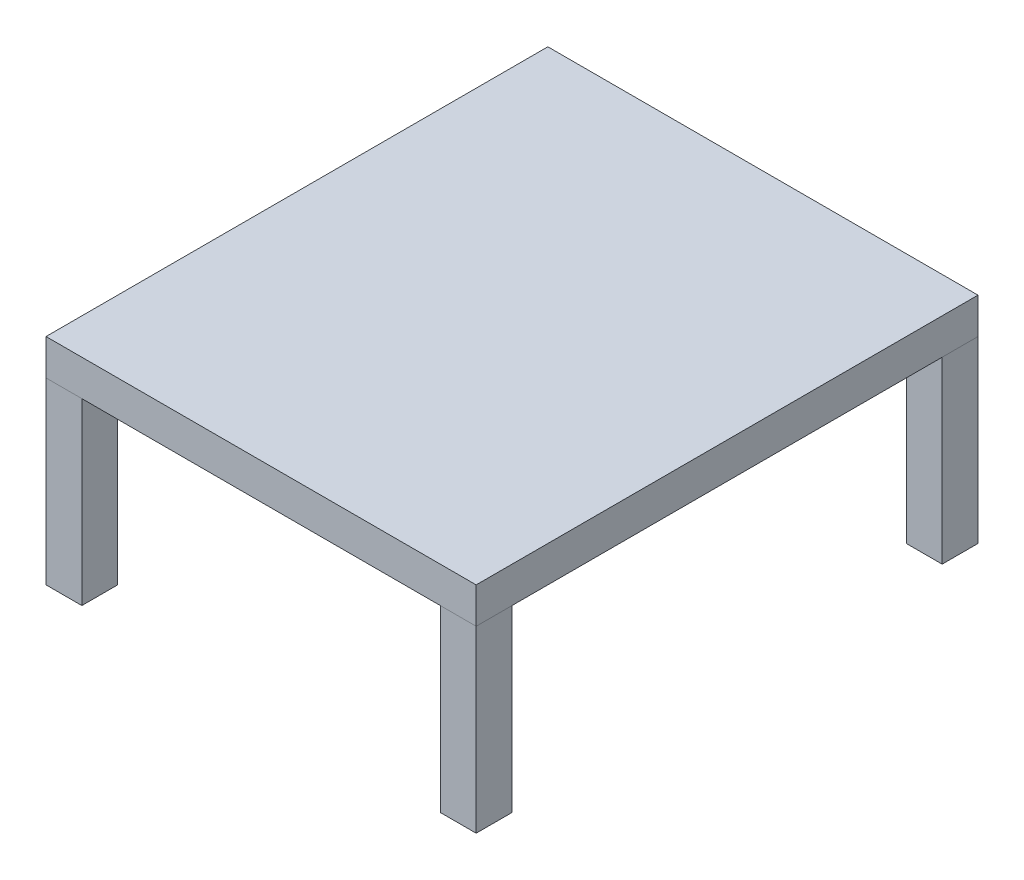
ISO-10303-21;
HEADER;
FILE_DESCRIPTION(('STEP AP214'),'2;1');
FILE_NAME('part.step','',(''),(''),'','','');
FILE_SCHEMA(('AUTOMOTIVE_DESIGN { 1 0 10303 214 1 1 1 1 }'));
ENDSEC;
DATA;
#1=APPLICATION_CONTEXT('core data for automotive mechanical design processes');
#2=APPLICATION_PROTOCOL_DEFINITION('international standard','automotive_design',2000,#1);
#3=PRODUCT_CONTEXT('',#1,'mechanical');
#4=PRODUCT('Part','Part','',(#3));
#5=PRODUCT_RELATED_PRODUCT_CATEGORY('part','',(#4));
#6=PRODUCT_DEFINITION_FORMATION('','',#4);
#7=PRODUCT_DEFINITION_CONTEXT('part definition',#1,'design');
#8=PRODUCT_DEFINITION('design','',#6,#7);
#9=PRODUCT_DEFINITION_SHAPE('','',#8);
#10=(LENGTH_UNIT() NAMED_UNIT(*) SI_UNIT(.MILLI.,.METRE.));
#11=(NAMED_UNIT(*) PLANE_ANGLE_UNIT() SI_UNIT($,.RADIAN.));
#12=(NAMED_UNIT(*) SI_UNIT($,.STERADIAN.) SOLID_ANGLE_UNIT());
#13=UNCERTAINTY_MEASURE_WITH_UNIT(LENGTH_MEASURE(1.E-05),#10,'distance_accuracy_value','');
#14=(GEOMETRIC_REPRESENTATION_CONTEXT(3) GLOBAL_UNCERTAINTY_ASSIGNED_CONTEXT((#13)) GLOBAL_UNIT_ASSIGNED_CONTEXT((#10,
#11,#12)) REPRESENTATION_CONTEXT('',''));
#15=CARTESIAN_POINT('',(0.,0.,0.));
#16=DIRECTION('',(0.,0.,1.));
#17=DIRECTION('',(1.,0.,0.));
#18=AXIS2_PLACEMENT_3D('',#15,#16,#17);
#19=CARTESIAN_POINT('',(304.8,304.8,-355.6));
#20=DIRECTION('',(-1.,0.,0.));
#21=DIRECTION('',(0.,0.,1.));
#22=AXIS2_PLACEMENT_3D('',#19,#20,#21);
#23=PLANE('',#22);
#24=DIRECTION('',(0.,0.,-1.));
#25=VECTOR('',#24,1.);
#26=CARTESIAN_POINT('',(304.8,254.,-355.6));
#27=LINE('',#26,#25);
#28=CARTESIAN_POINT('',(304.8,254.,355.6));
#29=VERTEX_POINT('',#28);
#30=CARTESIAN_POINT('',(304.8,254.,-355.6));
#31=VERTEX_POINT('',#30);
#32=EDGE_CURVE('E108',#29,#31,#27,.T.);
#33=ORIENTED_EDGE('',*,*,#32,.T.);
#34=DIRECTION('',(0.,-1.,0.));
#35=VECTOR('',#34,1.);
#36=CARTESIAN_POINT('',(304.8,304.8,-355.6));
#37=LINE('',#36,#35);
#38=CARTESIAN_POINT('',(304.8,304.8,-355.6));
#39=VERTEX_POINT('',#38);
#40=EDGE_CURVE('E12',#39,#31,#37,.T.);
#41=ORIENTED_EDGE('',*,*,#40,.F.);
#42=DIRECTION('',(0.,0.,-1.));
#43=VECTOR('',#42,1.);
#44=CARTESIAN_POINT('',(304.8,304.8,-355.6));
#45=LINE('',#44,#43);
#46=CARTESIAN_POINT('',(304.8,304.8,355.6));
#47=VERTEX_POINT('',#46);
#48=EDGE_CURVE('E96',#47,#39,#45,.T.);
#49=ORIENTED_EDGE('',*,*,#48,.F.);
#50=DIRECTION('',(0.,-1.,0.));
#51=VECTOR('',#50,1.);
#52=CARTESIAN_POINT('',(304.8,304.8,355.6));
#53=LINE('',#52,#51);
#54=EDGE_CURVE('E104',#47,#29,#53,.T.);
#55=ORIENTED_EDGE('',*,*,#54,.T.);
#56=EDGE_LOOP('',(#33,#41,#49,#55));
#57=FACE_BOUND('',#56,.T.);
#58=ADVANCED_FACE('F45',(#57),#23,.F.);
#59=CARTESIAN_POINT('',(304.8,304.8,-355.6));
#60=DIRECTION('',(0.,0.,1.));
#61=DIRECTION('',(1.,0.,0.));
#62=AXIS2_PLACEMENT_3D('',#59,#60,#61);
#63=PLANE('',#62);
#64=DIRECTION('',(-1.,0.,0.));
#65=VECTOR('',#64,1.);
#66=CARTESIAN_POINT('',(304.8,254.,-355.6));
#67=LINE('',#66,#65);
#68=CARTESIAN_POINT('',(-304.8,254.,-355.6));
#69=VERTEX_POINT('',#68);
#70=EDGE_CURVE('E100',#31,#69,#67,.T.);
#71=ORIENTED_EDGE('',*,*,#70,.T.);
#72=DIRECTION('',(0.,-1.,0.));
#73=VECTOR('',#72,1.);
#74=CARTESIAN_POINT('',(-304.8,304.8,-355.6));
#75=LINE('',#74,#73);
#76=CARTESIAN_POINT('',(-304.8,304.8,-355.6));
#77=VERTEX_POINT('',#76);
#78=EDGE_CURVE('E53',#77,#69,#75,.T.);
#79=ORIENTED_EDGE('',*,*,#78,.F.);
#80=DIRECTION('',(-1.,0.,0.));
#81=VECTOR('',#80,1.);
#82=CARTESIAN_POINT('',(304.8,304.8,-355.6));
#83=LINE('',#82,#81);
#84=EDGE_CURVE('E91',#39,#77,#83,.T.);
#85=ORIENTED_EDGE('',*,*,#84,.F.);
#86=ORIENTED_EDGE('',*,*,#40,.T.);
#87=EDGE_LOOP('',(#71,#79,#85,#86));
#88=FACE_BOUND('',#87,.T.);
#89=ADVANCED_FACE('F99',(#88),#63,.F.);
#90=CARTESIAN_POINT('',(-304.8,304.8,-355.6));
#91=DIRECTION('',(1.,0.,0.));
#92=DIRECTION('',(0.,0.,-1.));
#93=AXIS2_PLACEMENT_3D('',#90,#91,#92);
#94=PLANE('',#93);
#95=DIRECTION('',(0.,0.,1.));
#96=VECTOR('',#95,1.);
#97=CARTESIAN_POINT('',(-304.8,254.,-355.6));
#98=LINE('',#97,#96);
#99=CARTESIAN_POINT('',(-304.8,254.,355.6));
#100=VERTEX_POINT('',#99);
#101=EDGE_CURVE('E78',#69,#100,#98,.T.);
#102=ORIENTED_EDGE('',*,*,#101,.T.);
#103=DIRECTION('',(0.,-1.,0.));
#104=VECTOR('',#103,1.);
#105=CARTESIAN_POINT('',(-304.8,304.8,355.6));
#106=LINE('',#105,#104);
#107=CARTESIAN_POINT('',(-304.8,304.8,355.6));
#108=VERTEX_POINT('',#107);
#109=EDGE_CURVE('E101',#108,#100,#106,.T.);
#110=ORIENTED_EDGE('',*,*,#109,.F.);
#111=DIRECTION('',(0.,0.,1.));
#112=VECTOR('',#111,1.);
#113=CARTESIAN_POINT('',(-304.8,304.8,-355.6));
#114=LINE('',#113,#112);
#115=EDGE_CURVE('E94',#77,#108,#114,.T.);
#116=ORIENTED_EDGE('',*,*,#115,.F.);
#117=ORIENTED_EDGE('',*,*,#78,.T.);
#118=EDGE_LOOP('',(#102,#110,#116,#117));
#119=FACE_BOUND('',#118,.T.);
#120=ADVANCED_FACE('F102',(#119),#94,.F.);
#121=CARTESIAN_POINT('',(304.8,304.8,355.6));
#122=DIRECTION('',(0.,0.,-1.));
#123=DIRECTION('',(-1.,0.,0.));
#124=AXIS2_PLACEMENT_3D('',#121,#122,#123);
#125=PLANE('',#124);
#126=DIRECTION('',(1.,0.,0.));
#127=VECTOR('',#126,1.);
#128=CARTESIAN_POINT('',(304.8,254.,355.6));
#129=LINE('',#128,#127);
#130=EDGE_CURVE('E84',#100,#29,#129,.T.);
#131=ORIENTED_EDGE('',*,*,#130,.T.);
#132=ORIENTED_EDGE('',*,*,#54,.F.);
#133=DIRECTION('',(1.,0.,0.));
#134=VECTOR('',#133,1.);
#135=CARTESIAN_POINT('',(304.8,304.8,355.6));
#136=LINE('',#135,#134);
#137=EDGE_CURVE('E61',#108,#47,#136,.T.);
#138=ORIENTED_EDGE('',*,*,#137,.F.);
#139=ORIENTED_EDGE('',*,*,#109,.T.);
#140=EDGE_LOOP('',(#131,#132,#138,#139));
#141=FACE_BOUND('',#140,.T.);
#142=ADVANCED_FACE('F115',(#141),#125,.F.);
#143=CARTESIAN_POINT('',(0.,304.8,0.));
#144=DIRECTION('',(0.,-1.,0.));
#145=DIRECTION('',(0.,0.,-1.));
#146=AXIS2_PLACEMENT_3D('',#143,#144,#145);
#147=PLANE('',#146);
#148=ORIENTED_EDGE('',*,*,#48,.T.);
#149=ORIENTED_EDGE('',*,*,#84,.T.);
#150=ORIENTED_EDGE('',*,*,#115,.T.);
#151=ORIENTED_EDGE('',*,*,#137,.T.);
#152=EDGE_LOOP('',(#148,#149,#150,#151));
#153=FACE_BOUND('',#152,.T.);
#154=ADVANCED_FACE('F92',(#153),#147,.F.);
#155=CARTESIAN_POINT('',(0.,254.,0.));
#156=DIRECTION('',(0.,-1.,0.));
#157=DIRECTION('',(0.,0.,-1.));
#158=AXIS2_PLACEMENT_3D('',#155,#156,#157);
#159=PLANE('',#158);
#160=ORIENTED_EDGE('',*,*,#32,.F.);
#161=ORIENTED_EDGE('',*,*,#130,.F.);
#162=ORIENTED_EDGE('',*,*,#101,.F.);
#163=ORIENTED_EDGE('',*,*,#70,.F.);
#164=EDGE_LOOP('',(#160,#161,#162,#163));
#165=FACE_BOUND('',#164,.T.);
#166=ADVANCED_FACE('F118',(#165),#159,.T.);
#167=CLOSED_SHELL('',(#58,#89,#120,#142,#154,#166));
#168=MANIFOLD_SOLID_BREP('B2',#167);
#169=CARTESIAN_POINT('',(304.8,254.,355.6));
#170=DIRECTION('',(0.,0.,-1.));
#171=DIRECTION('',(1.,0.,0.));
#172=AXIS2_PLACEMENT_3D('',#169,#170,#171);
#173=PLANE('',#172);
#174=DIRECTION('',(-1.,0.,0.));
#175=VECTOR('',#174,1.);
#176=CARTESIAN_POINT('',(304.8,0.,355.6));
#177=LINE('',#176,#175);
#178=CARTESIAN_POINT('',(304.8,0.,355.6));
#179=VERTEX_POINT('',#178);
#180=CARTESIAN_POINT('',(254.,0.,355.6));
#181=VERTEX_POINT('',#180);
#182=EDGE_CURVE('E241',#179,#181,#177,.T.);
#183=ORIENTED_EDGE('',*,*,#182,.F.);
#184=DIRECTION('',(0.,-1.,0.));
#185=VECTOR('',#184,1.);
#186=CARTESIAN_POINT('',(304.8,254.,355.6));
#187=LINE('',#186,#185);
#188=CARTESIAN_POINT('',(304.8,254.,355.6));
#189=VERTEX_POINT('',#188);
#190=EDGE_CURVE('E240',#189,#179,#187,.T.);
#191=ORIENTED_EDGE('',*,*,#190,.F.);
#192=DIRECTION('',(-1.,0.,0.));
#193=VECTOR('',#192,1.);
#194=CARTESIAN_POINT('',(304.8,254.,355.6));
#195=LINE('',#194,#193);
#196=CARTESIAN_POINT('',(254.,254.,355.6));
#197=VERTEX_POINT('',#196);
#198=EDGE_CURVE('E235',#189,#197,#195,.T.);
#199=ORIENTED_EDGE('',*,*,#198,.T.);
#200=DIRECTION('',(0.,-1.,0.));
#201=VECTOR('',#200,1.);
#202=CARTESIAN_POINT('',(254.,254.,355.6));
#203=LINE('',#202,#201);
#204=EDGE_CURVE('E43',#197,#181,#203,.T.);
#205=ORIENTED_EDGE('',*,*,#204,.T.);
#206=EDGE_LOOP('',(#183,#191,#199,#205));
#207=FACE_BOUND('',#206,.T.);
#208=ADVANCED_FACE('F178',(#207),#173,.F.);
#209=CARTESIAN_POINT('',(254.,254.,355.6));
#210=DIRECTION('',(1.,0.,0.));
#211=DIRECTION('',(0.,0.,1.));
#212=AXIS2_PLACEMENT_3D('',#209,#210,#211);
#213=PLANE('',#212);
#214=DIRECTION('',(0.,0.,-1.));
#215=VECTOR('',#214,1.);
#216=CARTESIAN_POINT('',(254.,0.,355.6));
#217=LINE('',#216,#215);
#218=CARTESIAN_POINT('',(254.,0.,304.8));
#219=VERTEX_POINT('',#218);
#220=EDGE_CURVE('E243',#181,#219,#217,.T.);
#221=ORIENTED_EDGE('',*,*,#220,.F.);
#222=ORIENTED_EDGE('',*,*,#204,.F.);
#223=DIRECTION('',(0.,0.,-1.));
#224=VECTOR('',#223,1.);
#225=CARTESIAN_POINT('',(254.,254.,355.6));
#226=LINE('',#225,#224);
#227=CARTESIAN_POINT('',(254.,254.,304.8));
#228=VERTEX_POINT('',#227);
#229=EDGE_CURVE('E219',#197,#228,#226,.T.);
#230=ORIENTED_EDGE('',*,*,#229,.T.);
#231=DIRECTION('',(0.,-1.,0.));
#232=VECTOR('',#231,1.);
#233=CARTESIAN_POINT('',(254.,254.,304.8));
#234=LINE('',#233,#232);
#235=EDGE_CURVE('E186',#228,#219,#234,.T.);
#236=ORIENTED_EDGE('',*,*,#235,.T.);
#237=EDGE_LOOP('',(#221,#222,#230,#236));
#238=FACE_BOUND('',#237,.T.);
#239=ADVANCED_FACE('F233',(#238),#213,.F.);
#240=CARTESIAN_POINT('',(304.8,254.,304.8));
#241=DIRECTION('',(0.,0.,1.));
#242=DIRECTION('',(-1.,0.,0.));
#243=AXIS2_PLACEMENT_3D('',#240,#241,#242);
#244=PLANE('',#243);
#245=DIRECTION('',(1.,0.,0.));
#246=VECTOR('',#245,1.);
#247=CARTESIAN_POINT('',(304.8,0.,304.8));
#248=LINE('',#247,#246);
#249=CARTESIAN_POINT('',(304.8,0.,304.8));
#250=VERTEX_POINT('',#249);
#251=EDGE_CURVE('E229',#219,#250,#248,.T.);
#252=ORIENTED_EDGE('',*,*,#251,.F.);
#253=ORIENTED_EDGE('',*,*,#235,.F.);
#254=DIRECTION('',(1.,0.,0.));
#255=VECTOR('',#254,1.);
#256=CARTESIAN_POINT('',(304.8,254.,304.8));
#257=LINE('',#256,#255);
#258=CARTESIAN_POINT('',(304.8,254.,304.8));
#259=VERTEX_POINT('',#258);
#260=EDGE_CURVE('E222',#228,#259,#257,.T.);
#261=ORIENTED_EDGE('',*,*,#260,.T.);
#262=DIRECTION('',(0.,-1.,0.));
#263=VECTOR('',#262,1.);
#264=CARTESIAN_POINT('',(304.8,254.,304.8));
#265=LINE('',#264,#263);
#266=EDGE_CURVE('E232',#259,#250,#265,.T.);
#267=ORIENTED_EDGE('',*,*,#266,.T.);
#268=EDGE_LOOP('',(#252,#253,#261,#267));
#269=FACE_BOUND('',#268,.T.);
#270=ADVANCED_FACE('F228',(#269),#244,.F.);
#271=CARTESIAN_POINT('',(304.8,254.,355.6));
#272=DIRECTION('',(-1.,0.,0.));
#273=DIRECTION('',(0.,0.,-1.));
#274=AXIS2_PLACEMENT_3D('',#271,#272,#273);
#275=PLANE('',#274);
#276=DIRECTION('',(0.,0.,1.));
#277=VECTOR('',#276,1.);
#278=CARTESIAN_POINT('',(304.8,0.,355.6));
#279=LINE('',#278,#277);
#280=EDGE_CURVE('E208',#250,#179,#279,.T.);
#281=ORIENTED_EDGE('',*,*,#280,.F.);
#282=ORIENTED_EDGE('',*,*,#266,.F.);
#283=DIRECTION('',(0.,0.,1.));
#284=VECTOR('',#283,1.);
#285=CARTESIAN_POINT('',(304.8,254.,355.6));
#286=LINE('',#285,#284);
#287=EDGE_CURVE('E194',#259,#189,#286,.T.);
#288=ORIENTED_EDGE('',*,*,#287,.T.);
#289=ORIENTED_EDGE('',*,*,#190,.T.);
#290=EDGE_LOOP('',(#281,#282,#288,#289));
#291=FACE_BOUND('',#290,.T.);
#292=ADVANCED_FACE('F252',(#291),#275,.F.);
#293=CARTESIAN_POINT('',(0.,254.,0.));
#294=DIRECTION('',(0.,1.,0.));
#295=DIRECTION('',(0.,0.,1.));
#296=AXIS2_PLACEMENT_3D('',#293,#294,#295);
#297=PLANE('',#296);
#298=ORIENTED_EDGE('',*,*,#198,.F.);
#299=ORIENTED_EDGE('',*,*,#287,.F.);
#300=ORIENTED_EDGE('',*,*,#260,.F.);
#301=ORIENTED_EDGE('',*,*,#229,.F.);
#302=EDGE_LOOP('',(#298,#299,#300,#301));
#303=FACE_BOUND('',#302,.T.);
#304=ADVANCED_FACE('F224',(#303),#297,.T.);
#305=CARTESIAN_POINT('',(0.,0.,0.));
#306=DIRECTION('',(0.,1.,0.));
#307=DIRECTION('',(0.,0.,1.));
#308=AXIS2_PLACEMENT_3D('',#305,#306,#307);
#309=PLANE('',#308);
#310=ORIENTED_EDGE('',*,*,#182,.T.);
#311=ORIENTED_EDGE('',*,*,#220,.T.);
#312=ORIENTED_EDGE('',*,*,#251,.T.);
#313=ORIENTED_EDGE('',*,*,#280,.T.);
#314=EDGE_LOOP('',(#310,#311,#312,#313));
#315=FACE_BOUND('',#314,.T.);
#316=ADVANCED_FACE('F248',(#315),#309,.F.);
#317=CLOSED_SHELL('',(#208,#239,#270,#292,#304,#316));
#318=MANIFOLD_SOLID_BREP('B6',#317);
#319=CARTESIAN_POINT('',(254.,254.,-355.6));
#320=DIRECTION('',(1.,0.,0.));
#321=DIRECTION('',(0.,0.,1.));
#322=AXIS2_PLACEMENT_3D('',#319,#320,#321);
#323=PLANE('',#322);
#324=DIRECTION('',(0.,0.,-1.));
#325=VECTOR('',#324,1.);
#326=CARTESIAN_POINT('',(254.,0.,-355.6));
#327=LINE('',#326,#325);
#328=CARTESIAN_POINT('',(254.,0.,-304.8));
#329=VERTEX_POINT('',#328);
#330=CARTESIAN_POINT('',(254.,0.,-355.6));
#331=VERTEX_POINT('',#330);
#332=EDGE_CURVE('E374',#329,#331,#327,.T.);
#333=ORIENTED_EDGE('',*,*,#332,.F.);
#334=DIRECTION('',(0.,-1.,0.));
#335=VECTOR('',#334,1.);
#336=CARTESIAN_POINT('',(254.,254.,-304.8));
#337=LINE('',#336,#335);
#338=CARTESIAN_POINT('',(254.,254.,-304.8));
#339=VERTEX_POINT('',#338);
#340=EDGE_CURVE('E373',#339,#329,#337,.T.);
#341=ORIENTED_EDGE('',*,*,#340,.F.);
#342=DIRECTION('',(0.,0.,-1.));
#343=VECTOR('',#342,1.);
#344=CARTESIAN_POINT('',(254.,254.,-355.6));
#345=LINE('',#344,#343);
#346=CARTESIAN_POINT('',(254.,254.,-355.6));
#347=VERTEX_POINT('',#346);
#348=EDGE_CURVE('E368',#339,#347,#345,.T.);
#349=ORIENTED_EDGE('',*,*,#348,.T.);
#350=DIRECTION('',(0.,-1.,0.));
#351=VECTOR('',#350,1.);
#352=CARTESIAN_POINT('',(254.,254.,-355.6));
#353=LINE('',#352,#351);
#354=EDGE_CURVE('E176',#347,#331,#353,.T.);
#355=ORIENTED_EDGE('',*,*,#354,.T.);
#356=EDGE_LOOP('',(#333,#341,#349,#355));
#357=FACE_BOUND('',#356,.T.);
#358=ADVANCED_FACE('F311',(#357),#323,.F.);
#359=CARTESIAN_POINT('',(304.8,254.,-355.6));
#360=DIRECTION('',(0.,0.,1.));
#361=DIRECTION('',(-1.,0.,0.));
#362=AXIS2_PLACEMENT_3D('',#359,#360,#361);
#363=PLANE('',#362);
#364=DIRECTION('',(1.,0.,0.));
#365=VECTOR('',#364,1.);
#366=CARTESIAN_POINT('',(304.8,0.,-355.6));
#367=LINE('',#366,#365);
#368=CARTESIAN_POINT('',(304.8,0.,-355.6));
#369=VERTEX_POINT('',#368);
#370=EDGE_CURVE('E376',#331,#369,#367,.T.);
#371=ORIENTED_EDGE('',*,*,#370,.F.);
#372=ORIENTED_EDGE('',*,*,#354,.F.);
#373=DIRECTION('',(1.,0.,0.));
#374=VECTOR('',#373,1.);
#375=CARTESIAN_POINT('',(304.8,254.,-355.6));
#376=LINE('',#375,#374);
#377=CARTESIAN_POINT('',(304.8,254.,-355.6));
#378=VERTEX_POINT('',#377);
#379=EDGE_CURVE('E352',#347,#378,#376,.T.);
#380=ORIENTED_EDGE('',*,*,#379,.T.);
#381=DIRECTION('',(0.,-1.,0.));
#382=VECTOR('',#381,1.);
#383=CARTESIAN_POINT('',(304.8,254.,-355.6));
#384=LINE('',#383,#382);
#385=EDGE_CURVE('E319',#378,#369,#384,.T.);
#386=ORIENTED_EDGE('',*,*,#385,.T.);
#387=EDGE_LOOP('',(#371,#372,#380,#386));
#388=FACE_BOUND('',#387,.T.);
#389=ADVANCED_FACE('F366',(#388),#363,.F.);
#390=CARTESIAN_POINT('',(304.8,254.,-355.6));
#391=DIRECTION('',(-1.,0.,0.));
#392=DIRECTION('',(0.,0.,-1.));
#393=AXIS2_PLACEMENT_3D('',#390,#391,#392);
#394=PLANE('',#393);
#395=DIRECTION('',(0.,0.,1.));
#396=VECTOR('',#395,1.);
#397=CARTESIAN_POINT('',(304.8,0.,-355.6));
#398=LINE('',#397,#396);
#399=CARTESIAN_POINT('',(304.8,0.,-304.8));
#400=VERTEX_POINT('',#399);
#401=EDGE_CURVE('E362',#369,#400,#398,.T.);
#402=ORIENTED_EDGE('',*,*,#401,.F.);
#403=ORIENTED_EDGE('',*,*,#385,.F.);
#404=DIRECTION('',(0.,0.,1.));
#405=VECTOR('',#404,1.);
#406=CARTESIAN_POINT('',(304.8,254.,-355.6));
#407=LINE('',#406,#405);
#408=CARTESIAN_POINT('',(304.8,254.,-304.8));
#409=VERTEX_POINT('',#408);
#410=EDGE_CURVE('E355',#378,#409,#407,.T.);
#411=ORIENTED_EDGE('',*,*,#410,.T.);
#412=DIRECTION('',(0.,-1.,0.));
#413=VECTOR('',#412,1.);
#414=CARTESIAN_POINT('',(304.8,254.,-304.8));
#415=LINE('',#414,#413);
#416=EDGE_CURVE('E365',#409,#400,#415,.T.);
#417=ORIENTED_EDGE('',*,*,#416,.T.);
#418=EDGE_LOOP('',(#402,#403,#411,#417));
#419=FACE_BOUND('',#418,.T.);
#420=ADVANCED_FACE('F361',(#419),#394,.F.);
#421=CARTESIAN_POINT('',(304.8,254.,-304.8));
#422=DIRECTION('',(0.,0.,-1.));
#423=DIRECTION('',(1.,0.,0.));
#424=AXIS2_PLACEMENT_3D('',#421,#422,#423);
#425=PLANE('',#424);
#426=DIRECTION('',(-1.,0.,0.));
#427=VECTOR('',#426,1.);
#428=CARTESIAN_POINT('',(304.8,0.,-304.8));
#429=LINE('',#428,#427);
#430=EDGE_CURVE('E341',#400,#329,#429,.T.);
#431=ORIENTED_EDGE('',*,*,#430,.F.);
#432=ORIENTED_EDGE('',*,*,#416,.F.);
#433=DIRECTION('',(-1.,0.,0.));
#434=VECTOR('',#433,1.);
#435=CARTESIAN_POINT('',(304.8,254.,-304.8));
#436=LINE('',#435,#434);
#437=EDGE_CURVE('E327',#409,#339,#436,.T.);
#438=ORIENTED_EDGE('',*,*,#437,.T.);
#439=ORIENTED_EDGE('',*,*,#340,.T.);
#440=EDGE_LOOP('',(#431,#432,#438,#439));
#441=FACE_BOUND('',#440,.T.);
#442=ADVANCED_FACE('F385',(#441),#425,.F.);
#443=CARTESIAN_POINT('',(0.,254.,0.));
#444=DIRECTION('',(0.,1.,0.));
#445=DIRECTION('',(0.,0.,1.));
#446=AXIS2_PLACEMENT_3D('',#443,#444,#445);
#447=PLANE('',#446);
#448=ORIENTED_EDGE('',*,*,#348,.F.);
#449=ORIENTED_EDGE('',*,*,#437,.F.);
#450=ORIENTED_EDGE('',*,*,#410,.F.);
#451=ORIENTED_EDGE('',*,*,#379,.F.);
#452=EDGE_LOOP('',(#448,#449,#450,#451));
#453=FACE_BOUND('',#452,.T.);
#454=ADVANCED_FACE('F357',(#453),#447,.T.);
#455=CARTESIAN_POINT('',(0.,0.,0.));
#456=DIRECTION('',(0.,1.,0.));
#457=DIRECTION('',(0.,0.,1.));
#458=AXIS2_PLACEMENT_3D('',#455,#456,#457);
#459=PLANE('',#458);
#460=ORIENTED_EDGE('',*,*,#332,.T.);
#461=ORIENTED_EDGE('',*,*,#370,.T.);
#462=ORIENTED_EDGE('',*,*,#401,.T.);
#463=ORIENTED_EDGE('',*,*,#430,.T.);
#464=EDGE_LOOP('',(#460,#461,#462,#463));
#465=FACE_BOUND('',#464,.T.);
#466=ADVANCED_FACE('F381',(#465),#459,.F.);
#467=CLOSED_SHELL('',(#358,#389,#420,#442,#454,#466));
#468=MANIFOLD_SOLID_BREP('B37',#467);
#469=CARTESIAN_POINT('',(-304.8,254.,355.6));
#470=DIRECTION('',(0.,0.,-1.));
#471=DIRECTION('',(-1.,0.,0.));
#472=AXIS2_PLACEMENT_3D('',#469,#470,#471);
#473=PLANE('',#472);
#474=DIRECTION('',(1.,0.,0.));
#475=VECTOR('',#474,1.);
#476=CARTESIAN_POINT('',(-304.8,0.,355.6));
#477=LINE('',#476,#475);
#478=CARTESIAN_POINT('',(-304.8,0.,355.6));
#479=VERTEX_POINT('',#478);
#480=CARTESIAN_POINT('',(-254.,0.,355.6));
#481=VERTEX_POINT('',#480);
#482=EDGE_CURVE('E506',#479,#481,#477,.T.);
#483=ORIENTED_EDGE('',*,*,#482,.T.);
#484=DIRECTION('',(0.,-1.,0.));
#485=VECTOR('',#484,1.);
#486=CARTESIAN_POINT('',(-254.,254.,355.6));
#487=LINE('',#486,#485);
#488=CARTESIAN_POINT('',(-254.,254.,355.6));
#489=VERTEX_POINT('',#488);
#490=EDGE_CURVE('E309',#489,#481,#487,.T.);
#491=ORIENTED_EDGE('',*,*,#490,.F.);
#492=DIRECTION('',(1.,0.,0.));
#493=VECTOR('',#492,1.);
#494=CARTESIAN_POINT('',(-304.8,254.,355.6));
#495=LINE('',#494,#493);
#496=CARTESIAN_POINT('',(-304.8,254.,355.6));
#497=VERTEX_POINT('',#496);
#498=EDGE_CURVE('E494',#497,#489,#495,.T.);
#499=ORIENTED_EDGE('',*,*,#498,.F.);
#500=DIRECTION('',(0.,-1.,0.));
#501=VECTOR('',#500,1.);
#502=CARTESIAN_POINT('',(-304.8,254.,355.6));
#503=LINE('',#502,#501);
#504=EDGE_CURVE('E502',#497,#479,#503,.T.);
#505=ORIENTED_EDGE('',*,*,#504,.T.);
#506=EDGE_LOOP('',(#483,#491,#499,#505));
#507=FACE_BOUND('',#506,.T.);
#508=ADVANCED_FACE('F443',(#507),#473,.F.);
#509=CARTESIAN_POINT('',(-254.,254.,355.6));
#510=DIRECTION('',(-1.,0.,0.));
#511=DIRECTION('',(0.,0.,1.));
#512=AXIS2_PLACEMENT_3D('',#509,#510,#511);
#513=PLANE('',#512);
#514=DIRECTION('',(0.,0.,-1.));
#515=VECTOR('',#514,1.);
#516=CARTESIAN_POINT('',(-254.,0.,355.6));
#517=LINE('',#516,#515);
#518=CARTESIAN_POINT('',(-254.,0.,304.8));
#519=VERTEX_POINT('',#518);
#520=EDGE_CURVE('E498',#481,#519,#517,.T.);
#521=ORIENTED_EDGE('',*,*,#520,.T.);
#522=DIRECTION('',(0.,-1.,0.));
#523=VECTOR('',#522,1.);
#524=CARTESIAN_POINT('',(-254.,254.,304.8));
#525=LINE('',#524,#523);
#526=CARTESIAN_POINT('',(-254.,254.,304.8));
#527=VERTEX_POINT('',#526);
#528=EDGE_CURVE('E451',#527,#519,#525,.T.);
#529=ORIENTED_EDGE('',*,*,#528,.F.);
#530=DIRECTION('',(0.,0.,-1.));
#531=VECTOR('',#530,1.);
#532=CARTESIAN_POINT('',(-254.,254.,355.6));
#533=LINE('',#532,#531);
#534=EDGE_CURVE('E489',#489,#527,#533,.T.);
#535=ORIENTED_EDGE('',*,*,#534,.F.);
#536=ORIENTED_EDGE('',*,*,#490,.T.);
#537=EDGE_LOOP('',(#521,#529,#535,#536));
#538=FACE_BOUND('',#537,.T.);
#539=ADVANCED_FACE('F497',(#538),#513,.F.);
#540=CARTESIAN_POINT('',(-304.8,254.,304.8));
#541=DIRECTION('',(0.,0.,1.));
#542=DIRECTION('',(1.,0.,0.));
#543=AXIS2_PLACEMENT_3D('',#540,#541,#542);
#544=PLANE('',#543);
#545=DIRECTION('',(-1.,0.,0.));
#546=VECTOR('',#545,1.);
#547=CARTESIAN_POINT('',(-304.8,0.,304.8));
#548=LINE('',#547,#546);
#549=CARTESIAN_POINT('',(-304.8,0.,304.8));
#550=VERTEX_POINT('',#549);
#551=EDGE_CURVE('E476',#519,#550,#548,.T.);
#552=ORIENTED_EDGE('',*,*,#551,.T.);
#553=DIRECTION('',(0.,-1.,0.));
#554=VECTOR('',#553,1.);
#555=CARTESIAN_POINT('',(-304.8,254.,304.8));
#556=LINE('',#555,#554);
#557=CARTESIAN_POINT('',(-304.8,254.,304.8));
#558=VERTEX_POINT('',#557);
#559=EDGE_CURVE('E499',#558,#550,#556,.T.);
#560=ORIENTED_EDGE('',*,*,#559,.F.);
#561=DIRECTION('',(-1.,0.,0.));
#562=VECTOR('',#561,1.);
#563=CARTESIAN_POINT('',(-304.8,254.,304.8));
#564=LINE('',#563,#562);
#565=EDGE_CURVE('E492',#527,#558,#564,.T.);
#566=ORIENTED_EDGE('',*,*,#565,.F.);
#567=ORIENTED_EDGE('',*,*,#528,.T.);
#568=EDGE_LOOP('',(#552,#560,#566,#567));
#569=FACE_BOUND('',#568,.T.);
#570=ADVANCED_FACE('F500',(#569),#544,.F.);
#571=CARTESIAN_POINT('',(-304.8,254.,355.6));
#572=DIRECTION('',(1.,0.,0.));
#573=DIRECTION('',(0.,0.,-1.));
#574=AXIS2_PLACEMENT_3D('',#571,#572,#573);
#575=PLANE('',#574);
#576=DIRECTION('',(0.,0.,1.));
#577=VECTOR('',#576,1.);
#578=CARTESIAN_POINT('',(-304.8,0.,355.6));
#579=LINE('',#578,#577);
#580=EDGE_CURVE('E482',#550,#479,#579,.T.);
#581=ORIENTED_EDGE('',*,*,#580,.T.);
#582=ORIENTED_EDGE('',*,*,#504,.F.);
#583=DIRECTION('',(0.,0.,1.));
#584=VECTOR('',#583,1.);
#585=CARTESIAN_POINT('',(-304.8,254.,355.6));
#586=LINE('',#585,#584);
#587=EDGE_CURVE('E459',#558,#497,#586,.T.);
#588=ORIENTED_EDGE('',*,*,#587,.F.);
#589=ORIENTED_EDGE('',*,*,#559,.T.);
#590=EDGE_LOOP('',(#581,#582,#588,#589));
#591=FACE_BOUND('',#590,.T.);
#592=ADVANCED_FACE('F513',(#591),#575,.F.);
#593=CARTESIAN_POINT('',(0.,254.,0.));
#594=DIRECTION('',(0.,1.,0.));
#595=DIRECTION('',(0.,0.,1.));
#596=AXIS2_PLACEMENT_3D('',#593,#594,#595);
#597=PLANE('',#596);
#598=ORIENTED_EDGE('',*,*,#498,.T.);
#599=ORIENTED_EDGE('',*,*,#534,.T.);
#600=ORIENTED_EDGE('',*,*,#565,.T.);
#601=ORIENTED_EDGE('',*,*,#587,.T.);
#602=EDGE_LOOP('',(#598,#599,#600,#601));
#603=FACE_BOUND('',#602,.T.);
#604=ADVANCED_FACE('F490',(#603),#597,.T.);
#605=CARTESIAN_POINT('',(0.,0.,0.));
#606=DIRECTION('',(0.,1.,0.));
#607=DIRECTION('',(0.,0.,1.));
#608=AXIS2_PLACEMENT_3D('',#605,#606,#607);
#609=PLANE('',#608);
#610=ORIENTED_EDGE('',*,*,#482,.F.);
#611=ORIENTED_EDGE('',*,*,#580,.F.);
#612=ORIENTED_EDGE('',*,*,#551,.F.);
#613=ORIENTED_EDGE('',*,*,#520,.F.);
#614=EDGE_LOOP('',(#610,#611,#612,#613));
#615=FACE_BOUND('',#614,.T.);
#616=ADVANCED_FACE('F516',(#615),#609,.F.);
#617=CLOSED_SHELL('',(#508,#539,#570,#592,#604,#616));
#618=MANIFOLD_SOLID_BREP('B170',#617);
#619=CARTESIAN_POINT('',(-254.,254.,-355.6));
#620=DIRECTION('',(-1.,0.,0.));
#621=DIRECTION('',(0.,0.,1.));
#622=AXIS2_PLACEMENT_3D('',#619,#620,#621);
#623=PLANE('',#622);
#624=DIRECTION('',(0.,0.,-1.));
#625=VECTOR('',#624,1.);
#626=CARTESIAN_POINT('',(-254.,0.,-355.6));
#627=LINE('',#626,#625);
#628=CARTESIAN_POINT('',(-254.,0.,-304.8));
#629=VERTEX_POINT('',#628);
#630=CARTESIAN_POINT('',(-254.,0.,-355.6));
#631=VERTEX_POINT('',#630);
#632=EDGE_CURVE('E629',#629,#631,#627,.T.);
#633=ORIENTED_EDGE('',*,*,#632,.T.);
#634=DIRECTION('',(0.,-1.,0.));
#635=VECTOR('',#634,1.);
#636=CARTESIAN_POINT('',(-254.,254.,-355.6));
#637=LINE('',#636,#635);
#638=CARTESIAN_POINT('',(-254.,254.,-355.6));
#639=VERTEX_POINT('',#638);
#640=EDGE_CURVE('E441',#639,#631,#637,.T.);
#641=ORIENTED_EDGE('',*,*,#640,.F.);
#642=DIRECTION('',(0.,0.,-1.));
#643=VECTOR('',#642,1.);
#644=CARTESIAN_POINT('',(-254.,254.,-355.6));
#645=LINE('',#644,#643);
#646=CARTESIAN_POINT('',(-254.,254.,-304.8));
#647=VERTEX_POINT('',#646);
#648=EDGE_CURVE('E617',#647,#639,#645,.T.);
#649=ORIENTED_EDGE('',*,*,#648,.F.);
#650=DIRECTION('',(0.,-1.,0.));
#651=VECTOR('',#650,1.);
#652=CARTESIAN_POINT('',(-254.,254.,-304.8));
#653=LINE('',#652,#651);
#654=EDGE_CURVE('E625',#647,#629,#653,.T.);
#655=ORIENTED_EDGE('',*,*,#654,.T.);
#656=EDGE_LOOP('',(#633,#641,#649,#655));
#657=FACE_BOUND('',#656,.T.);
#658=ADVANCED_FACE('F566',(#657),#623,.F.);
#659=CARTESIAN_POINT('',(-304.8,254.,-355.6));
#660=DIRECTION('',(0.,0.,1.));
#661=DIRECTION('',(1.,0.,0.));
#662=AXIS2_PLACEMENT_3D('',#659,#660,#661);
#663=PLANE('',#662);
#664=DIRECTION('',(-1.,0.,0.));
#665=VECTOR('',#664,1.);
#666=CARTESIAN_POINT('',(-304.8,0.,-355.6));
#667=LINE('',#666,#665);
#668=CARTESIAN_POINT('',(-304.8,0.,-355.6));
#669=VERTEX_POINT('',#668);
#670=EDGE_CURVE('E621',#631,#669,#667,.T.);
#671=ORIENTED_EDGE('',*,*,#670,.T.);
#672=DIRECTION('',(0.,-1.,0.));
#673=VECTOR('',#672,1.);
#674=CARTESIAN_POINT('',(-304.8,254.,-355.6));
#675=LINE('',#674,#673);
#676=CARTESIAN_POINT('',(-304.8,254.,-355.6));
#677=VERTEX_POINT('',#676);
#678=EDGE_CURVE('E574',#677,#669,#675,.T.);
#679=ORIENTED_EDGE('',*,*,#678,.F.);
#680=DIRECTION('',(-1.,0.,0.));
#681=VECTOR('',#680,1.);
#682=CARTESIAN_POINT('',(-304.8,254.,-355.6));
#683=LINE('',#682,#681);
#684=EDGE_CURVE('E612',#639,#677,#683,.T.);
#685=ORIENTED_EDGE('',*,*,#684,.F.);
#686=ORIENTED_EDGE('',*,*,#640,.T.);
#687=EDGE_LOOP('',(#671,#679,#685,#686));
#688=FACE_BOUND('',#687,.T.);
#689=ADVANCED_FACE('F620',(#688),#663,.F.);
#690=CARTESIAN_POINT('',(-304.8,254.,-355.6));
#691=DIRECTION('',(1.,0.,0.));
#692=DIRECTION('',(0.,0.,-1.));
#693=AXIS2_PLACEMENT_3D('',#690,#691,#692);
#694=PLANE('',#693);
#695=DIRECTION('',(0.,0.,1.));
#696=VECTOR('',#695,1.);
#697=CARTESIAN_POINT('',(-304.8,0.,-355.6));
#698=LINE('',#697,#696);
#699=CARTESIAN_POINT('',(-304.8,0.,-304.8));
#700=VERTEX_POINT('',#699);
#701=EDGE_CURVE('E599',#669,#700,#698,.T.);
#702=ORIENTED_EDGE('',*,*,#701,.T.);
#703=DIRECTION('',(0.,-1.,0.));
#704=VECTOR('',#703,1.);
#705=CARTESIAN_POINT('',(-304.8,254.,-304.8));
#706=LINE('',#705,#704);
#707=CARTESIAN_POINT('',(-304.8,254.,-304.8));
#708=VERTEX_POINT('',#707);
#709=EDGE_CURVE('E622',#708,#700,#706,.T.);
#710=ORIENTED_EDGE('',*,*,#709,.F.);
#711=DIRECTION('',(0.,0.,1.));
#712=VECTOR('',#711,1.);
#713=CARTESIAN_POINT('',(-304.8,254.,-355.6));
#714=LINE('',#713,#712);
#715=EDGE_CURVE('E615',#677,#708,#714,.T.);
#716=ORIENTED_EDGE('',*,*,#715,.F.);
#717=ORIENTED_EDGE('',*,*,#678,.T.);
#718=EDGE_LOOP('',(#702,#710,#716,#717));
#719=FACE_BOUND('',#718,.T.);
#720=ADVANCED_FACE('F623',(#719),#694,.F.);
#721=CARTESIAN_POINT('',(-304.8,254.,-304.8));
#722=DIRECTION('',(0.,0.,-1.));
#723=DIRECTION('',(-1.,0.,0.));
#724=AXIS2_PLACEMENT_3D('',#721,#722,#723);
#725=PLANE('',#724);
#726=DIRECTION('',(1.,0.,0.));
#727=VECTOR('',#726,1.);
#728=CARTESIAN_POINT('',(-304.8,0.,-304.8));
#729=LINE('',#728,#727);
#730=EDGE_CURVE('E605',#700,#629,#729,.T.);
#731=ORIENTED_EDGE('',*,*,#730,.T.);
#732=ORIENTED_EDGE('',*,*,#654,.F.);
#733=DIRECTION('',(1.,0.,0.));
#734=VECTOR('',#733,1.);
#735=CARTESIAN_POINT('',(-304.8,254.,-304.8));
#736=LINE('',#735,#734);
#737=EDGE_CURVE('E582',#708,#647,#736,.T.);
#738=ORIENTED_EDGE('',*,*,#737,.F.);
#739=ORIENTED_EDGE('',*,*,#709,.T.);
#740=EDGE_LOOP('',(#731,#732,#738,#739));
#741=FACE_BOUND('',#740,.T.);
#742=ADVANCED_FACE('F636',(#741),#725,.F.);
#743=CARTESIAN_POINT('',(0.,254.,0.));
#744=DIRECTION('',(0.,1.,0.));
#745=DIRECTION('',(0.,0.,1.));
#746=AXIS2_PLACEMENT_3D('',#743,#744,#745);
#747=PLANE('',#746);
#748=ORIENTED_EDGE('',*,*,#648,.T.);
#749=ORIENTED_EDGE('',*,*,#684,.T.);
#750=ORIENTED_EDGE('',*,*,#715,.T.);
#751=ORIENTED_EDGE('',*,*,#737,.T.);
#752=EDGE_LOOP('',(#748,#749,#750,#751));
#753=FACE_BOUND('',#752,.T.);
#754=ADVANCED_FACE('F613',(#753),#747,.T.);
#755=CARTESIAN_POINT('',(0.,0.,0.));
#756=DIRECTION('',(0.,1.,0.));
#757=DIRECTION('',(0.,0.,1.));
#758=AXIS2_PLACEMENT_3D('',#755,#756,#757);
#759=PLANE('',#758);
#760=ORIENTED_EDGE('',*,*,#632,.F.);
#761=ORIENTED_EDGE('',*,*,#730,.F.);
#762=ORIENTED_EDGE('',*,*,#701,.F.);
#763=ORIENTED_EDGE('',*,*,#670,.F.);
#764=EDGE_LOOP('',(#760,#761,#762,#763));
#765=FACE_BOUND('',#764,.T.);
#766=ADVANCED_FACE('F639',(#765),#759,.F.);
#767=CLOSED_SHELL('',(#658,#689,#720,#742,#754,#766));
#768=MANIFOLD_SOLID_BREP('B303',#767);
#769=ADVANCED_BREP_SHAPE_REPRESENTATION('',(#18,#168,#318,#468,#618,#768),#14);
#770=SHAPE_DEFINITION_REPRESENTATION(#9,#769);
ENDSEC;
END-ISO-10303-21;
